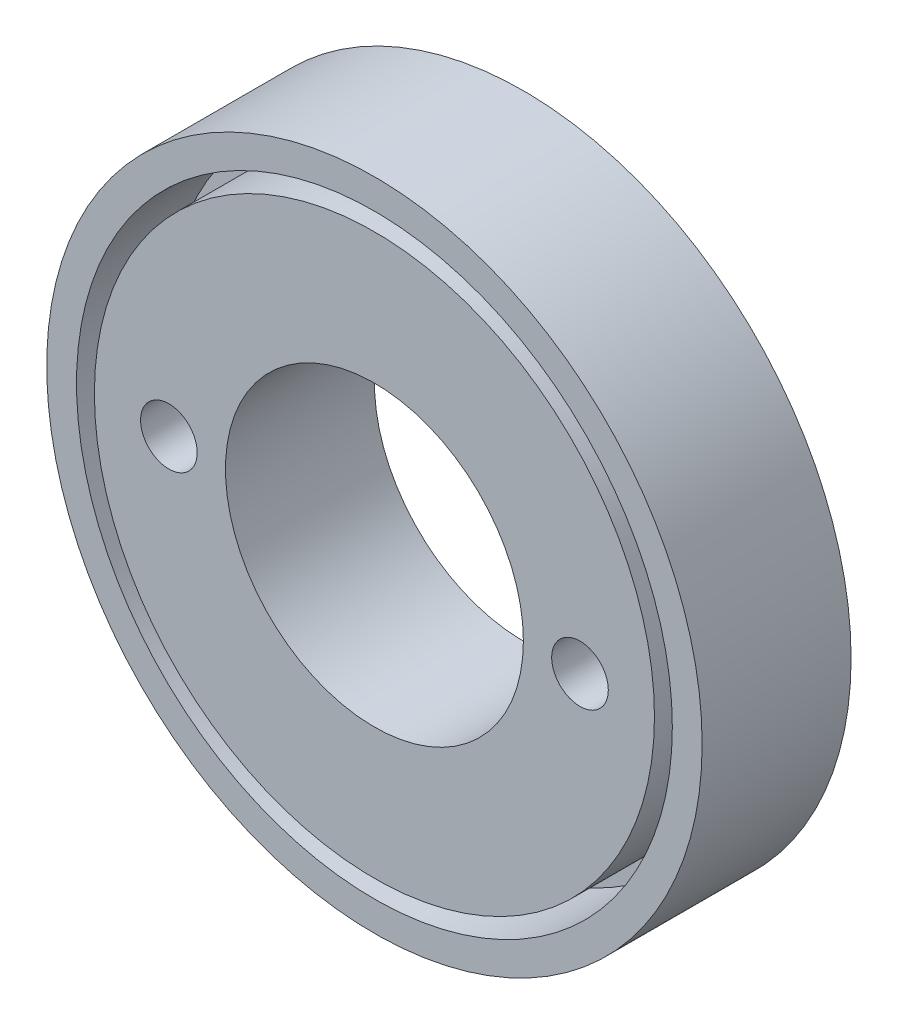
ISO-10303-21;
HEADER;
FILE_DESCRIPTION(('STEP AP214'),'2;1');
FILE_NAME('part.step','',(''),(''),'','','');
FILE_SCHEMA(('AUTOMOTIVE_DESIGN { 1 0 10303 214 1 1 1 1 }'));
ENDSEC;
DATA;
#1=APPLICATION_CONTEXT('core data for automotive mechanical design processes');
#2=APPLICATION_PROTOCOL_DEFINITION('international standard','automotive_design',2000,#1);
#3=PRODUCT_CONTEXT('',#1,'mechanical');
#4=PRODUCT('Part','Part','',(#3));
#5=PRODUCT_RELATED_PRODUCT_CATEGORY('part','',(#4));
#6=PRODUCT_DEFINITION_FORMATION('','',#4);
#7=PRODUCT_DEFINITION_CONTEXT('part definition',#1,'design');
#8=PRODUCT_DEFINITION('design','',#6,#7);
#9=PRODUCT_DEFINITION_SHAPE('','',#8);
#10=(LENGTH_UNIT() NAMED_UNIT(*) SI_UNIT(.MILLI.,.METRE.));
#11=(NAMED_UNIT(*) PLANE_ANGLE_UNIT() SI_UNIT($,.RADIAN.));
#12=(NAMED_UNIT(*) SI_UNIT($,.STERADIAN.) SOLID_ANGLE_UNIT());
#13=UNCERTAINTY_MEASURE_WITH_UNIT(LENGTH_MEASURE(1.E-05),#10,'distance_accuracy_value','');
#14=(GEOMETRIC_REPRESENTATION_CONTEXT(3) GLOBAL_UNCERTAINTY_ASSIGNED_CONTEXT((#13)) GLOBAL_UNIT_ASSIGNED_CONTEXT((#10,
#11,#12)) REPRESENTATION_CONTEXT('',''));
#15=CARTESIAN_POINT('',(0.,0.,0.));
#16=DIRECTION('',(0.,0.,1.));
#17=DIRECTION('',(1.,0.,0.));
#18=AXIS2_PLACEMENT_3D('',#15,#16,#17);
#19=CARTESIAN_POINT('',(0.,0.,10.));
#20=DIRECTION('',(0.,0.,1.));
#21=DIRECTION('',(1.,0.,0.));
#22=AXIS2_PLACEMENT_3D('',#19,#20,#21);
#23=PLANE('',#22);
#24=CARTESIAN_POINT('',(0.,0.,10.));
#25=DIRECTION('',(0.,0.,1.));
#26=DIRECTION('',(1.,0.,0.));
#27=AXIS2_PLACEMENT_3D('',#24,#25,#26);
#28=CIRCLE('',#27,47.);
#29=CARTESIAN_POINT('',(47.,0.,10.));
#30=VERTEX_POINT('',#29);
#31=EDGE_CURVE('E83',#30,#30,#28,.T.);
#32=ORIENTED_EDGE('',*,*,#31,.T.);
#33=EDGE_LOOP('',(#32));
#34=FACE_BOUND('',#33,.T.);
#35=CARTESIAN_POINT('',(34.5,0.,10.));
#36=DIRECTION('',(0.,0.,1.));
#37=DIRECTION('',(1.,0.,0.));
#38=AXIS2_PLACEMENT_3D('',#35,#36,#37);
#39=CIRCLE('',#38,4.75);
#40=CARTESIAN_POINT('',(39.25,0.,10.));
#41=VERTEX_POINT('',#40);
#42=EDGE_CURVE('E67',#41,#41,#39,.F.);
#43=ORIENTED_EDGE('',*,*,#42,.T.);
#44=EDGE_LOOP('',(#43));
#45=FACE_BOUND('',#44,.T.);
#46=CARTESIAN_POINT('',(0.,0.,10.));
#47=DIRECTION('',(0.,0.,1.));
#48=DIRECTION('',(1.,0.,0.));
#49=AXIS2_PLACEMENT_3D('',#46,#47,#48);
#50=CIRCLE('',#49,25.);
#51=CARTESIAN_POINT('',(25.,0.,10.));
#52=VERTEX_POINT('',#51);
#53=EDGE_CURVE('E61',#52,#52,#50,.T.);
#54=ORIENTED_EDGE('',*,*,#53,.F.);
#55=EDGE_LOOP('',(#54));
#56=FACE_BOUND('',#55,.T.);
#57=CARTESIAN_POINT('',(-34.5,0.,10.));
#58=DIRECTION('',(0.,0.,1.));
#59=DIRECTION('',(1.,0.,0.));
#60=AXIS2_PLACEMENT_3D('',#57,#58,#59);
#61=CIRCLE('',#60,4.75);
#62=CARTESIAN_POINT('',(-29.75,0.,10.));
#63=VERTEX_POINT('',#62);
#64=EDGE_CURVE('E73',#63,#63,#61,.T.);
#65=ORIENTED_EDGE('',*,*,#64,.F.);
#66=EDGE_LOOP('',(#65));
#67=FACE_BOUND('',#66,.T.);
#68=ADVANCED_FACE('F46',(#34,#45,#56,#67),#23,.T.);
#69=CARTESIAN_POINT('',(0.,0.,10.));
#70=DIRECTION('',(0.,0.,1.));
#71=DIRECTION('',(1.,0.,0.));
#72=AXIS2_PLACEMENT_3D('',#69,#70,#71);
#73=CIRCLE('',#72,55.);
#74=CARTESIAN_POINT('',(55.,0.,10.));
#75=VERTEX_POINT('',#74);
#76=EDGE_CURVE('E57',#75,#75,#73,.T.);
#77=ORIENTED_EDGE('',*,*,#76,.T.);
#78=EDGE_LOOP('',(#77));
#79=FACE_BOUND('',#78,.T.);
#80=CARTESIAN_POINT('',(0.,0.,10.));
#81=DIRECTION('',(0.,0.,1.));
#82=DIRECTION('',(1.,0.,0.));
#83=AXIS2_PLACEMENT_3D('',#80,#81,#82);
#84=CIRCLE('',#83,50.);
#85=CARTESIAN_POINT('',(50.,0.,10.));
#86=VERTEX_POINT('',#85);
#87=EDGE_CURVE('E79',#86,#86,#84,.T.);
#88=ORIENTED_EDGE('',*,*,#87,.F.);
#89=EDGE_LOOP('',(#88));
#90=FACE_BOUND('',#89,.T.);
#91=ADVANCED_FACE('F107',(#79,#90),#23,.T.);
#92=CARTESIAN_POINT('',(0.,0.,-15.));
#93=DIRECTION('',(0.,0.,1.));
#94=DIRECTION('',(1.,0.,0.));
#95=AXIS2_PLACEMENT_3D('',#92,#93,#94);
#96=CYLINDRICAL_SURFACE('',#95,55.);
#97=CARTESIAN_POINT('',(0.,0.,-15.));
#98=DIRECTION('',(0.,0.,1.));
#99=DIRECTION('',(1.,0.,0.));
#100=AXIS2_PLACEMENT_3D('',#97,#98,#99);
#101=CIRCLE('',#100,55.);
#102=CARTESIAN_POINT('',(55.,0.,-15.));
#103=VERTEX_POINT('',#102);
#104=EDGE_CURVE('E11',#103,#103,#101,.T.);
#105=ORIENTED_EDGE('',*,*,#104,.T.);
#106=EDGE_LOOP('',(#105));
#107=FACE_BOUND('',#106,.T.);
#108=ORIENTED_EDGE('',*,*,#76,.F.);
#109=EDGE_LOOP('',(#108));
#110=FACE_BOUND('',#109,.T.);
#111=ADVANCED_FACE('F48',(#107,#110),#96,.T.);
#112=CARTESIAN_POINT('',(0.,0.,-15.));
#113=DIRECTION('',(0.,0.,1.));
#114=DIRECTION('',(1.,0.,0.));
#115=AXIS2_PLACEMENT_3D('',#112,#113,#114);
#116=PLANE('',#115);
#117=CARTESIAN_POINT('',(0.,0.,-15.));
#118=DIRECTION('',(0.,0.,1.));
#119=DIRECTION('',(1.,0.,0.));
#120=AXIS2_PLACEMENT_3D('',#117,#118,#119);
#121=CIRCLE('',#120,25.);
#122=CARTESIAN_POINT('',(25.,0.,-15.));
#123=VERTEX_POINT('',#122);
#124=EDGE_CURVE('E53',#123,#123,#121,.T.);
#125=ORIENTED_EDGE('',*,*,#124,.T.);
#126=EDGE_LOOP('',(#125));
#127=FACE_BOUND('',#126,.T.);
#128=ORIENTED_EDGE('',*,*,#104,.F.);
#129=EDGE_LOOP('',(#128));
#130=FACE_BOUND('',#129,.T.);
#131=ADVANCED_FACE('F115',(#127,#130),#116,.F.);
#132=CARTESIAN_POINT('',(0.,0.,-15.));
#133=DIRECTION('',(0.,0.,1.));
#134=DIRECTION('',(1.,0.,0.));
#135=AXIS2_PLACEMENT_3D('',#132,#133,#134);
#136=CYLINDRICAL_SURFACE('',#135,25.);
#137=ORIENTED_EDGE('',*,*,#124,.F.);
#138=EDGE_LOOP('',(#137));
#139=FACE_BOUND('',#138,.T.);
#140=ORIENTED_EDGE('',*,*,#53,.T.);
#141=EDGE_LOOP('',(#140));
#142=FACE_BOUND('',#141,.T.);
#143=ADVANCED_FACE('F121',(#139,#142),#136,.F.);
#144=CARTESIAN_POINT('',(34.5,0.,-5.));
#145=DIRECTION('',(0.,0.,1.));
#146=DIRECTION('',(1.,0.,0.));
#147=AXIS2_PLACEMENT_3D('',#144,#145,#146);
#148=CYLINDRICAL_SURFACE('',#147,4.75);
#149=CARTESIAN_POINT('',(34.5,0.,-5.));
#150=DIRECTION('',(0.,0.,1.));
#151=DIRECTION('',(1.,0.,0.));
#152=AXIS2_PLACEMENT_3D('',#149,#150,#151);
#153=CIRCLE('',#152,4.75);
#154=CARTESIAN_POINT('',(39.25,0.,-5.));
#155=VERTEX_POINT('',#154);
#156=EDGE_CURVE('E66',#155,#155,#153,.F.);
#157=ORIENTED_EDGE('',*,*,#156,.T.);
#158=EDGE_LOOP('',(#157));
#159=FACE_BOUND('',#158,.T.);
#160=ORIENTED_EDGE('',*,*,#42,.F.);
#161=EDGE_LOOP('',(#160));
#162=FACE_BOUND('',#161,.T.);
#163=ADVANCED_FACE('F119',(#159,#162),#148,.F.);
#164=CARTESIAN_POINT('',(0.,0.,-5.));
#165=DIRECTION('',(0.,0.,1.));
#166=DIRECTION('',(1.,0.,0.));
#167=AXIS2_PLACEMENT_3D('',#164,#165,#166);
#168=PLANE('',#167);
#169=ORIENTED_EDGE('',*,*,#156,.F.);
#170=EDGE_LOOP('',(#169));
#171=FACE_BOUND('',#170,.T.);
#172=ADVANCED_FACE('F141',(#171),#168,.T.);
#173=CARTESIAN_POINT('',(0.,0.,-5.));
#174=DIRECTION('',(0.,0.,1.));
#175=DIRECTION('',(1.,0.,0.));
#176=AXIS2_PLACEMENT_3D('',#173,#174,#175);
#177=CYLINDRICAL_SURFACE('',#176,47.);
#178=CARTESIAN_POINT('',(0.,0.,-5.));
#179=DIRECTION('',(0.,0.,1.));
#180=DIRECTION('',(1.,0.,0.));
#181=AXIS2_PLACEMENT_3D('',#178,#179,#180);
#182=CIRCLE('',#181,47.);
#183=CARTESIAN_POINT('',(47.,0.,-5.));
#184=VERTEX_POINT('',#183);
#185=EDGE_CURVE('E82',#184,#184,#182,.T.);
#186=ORIENTED_EDGE('',*,*,#185,.T.);
#187=EDGE_LOOP('',(#186));
#188=FACE_BOUND('',#187,.T.);
#189=ORIENTED_EDGE('',*,*,#31,.F.);
#190=EDGE_LOOP('',(#189));
#191=FACE_BOUND('',#190,.T.);
#192=ADVANCED_FACE('F91',(#188,#191),#177,.T.);
#193=CARTESIAN_POINT('',(0.,0.,-5.));
#194=DIRECTION('',(0.,0.,1.));
#195=DIRECTION('',(1.,0.,0.));
#196=AXIS2_PLACEMENT_3D('',#193,#194,#195);
#197=CYLINDRICAL_SURFACE('',#196,50.);
#198=CARTESIAN_POINT('',(0.,0.,-5.));
#199=DIRECTION('',(0.,0.,1.));
#200=DIRECTION('',(1.,0.,0.));
#201=AXIS2_PLACEMENT_3D('',#198,#199,#200);
#202=CIRCLE('',#201,50.);
#203=CARTESIAN_POINT('',(50.,0.,-5.));
#204=VERTEX_POINT('',#203);
#205=EDGE_CURVE('E76',#204,#204,#202,.T.);
#206=ORIENTED_EDGE('',*,*,#205,.F.);
#207=EDGE_LOOP('',(#206));
#208=FACE_BOUND('',#207,.T.);
#209=ORIENTED_EDGE('',*,*,#87,.T.);
#210=EDGE_LOOP('',(#209));
#211=FACE_BOUND('',#210,.T.);
#212=ADVANCED_FACE('F98',(#208,#211),#197,.F.);
#213=CARTESIAN_POINT('',(0.,0.,-5.));
#214=DIRECTION('',(0.,0.,1.));
#215=DIRECTION('',(1.,0.,0.));
#216=AXIS2_PLACEMENT_3D('',#213,#214,#215);
#217=PLANE('',#216);
#218=ORIENTED_EDGE('',*,*,#185,.F.);
#219=EDGE_LOOP('',(#218));
#220=FACE_BOUND('',#219,.T.);
#221=ORIENTED_EDGE('',*,*,#205,.T.);
#222=EDGE_LOOP('',(#221));
#223=FACE_BOUND('',#222,.T.);
#224=ADVANCED_FACE('F94',(#220,#223),#217,.T.);
#225=CARTESIAN_POINT('',(-34.5,0.,-5.));
#226=DIRECTION('',(0.,0.,1.));
#227=DIRECTION('',(1.,0.,0.));
#228=AXIS2_PLACEMENT_3D('',#225,#226,#227);
#229=CYLINDRICAL_SURFACE('',#228,4.75);
#230=CARTESIAN_POINT('',(-34.5,0.,-5.));
#231=DIRECTION('',(0.,0.,1.));
#232=DIRECTION('',(1.,0.,0.));
#233=AXIS2_PLACEMENT_3D('',#230,#231,#232);
#234=CIRCLE('',#233,4.75);
#235=CARTESIAN_POINT('',(-29.75,0.,-5.));
#236=VERTEX_POINT('',#235);
#237=EDGE_CURVE('E70',#236,#236,#234,.T.);
#238=ORIENTED_EDGE('',*,*,#237,.F.);
#239=EDGE_LOOP('',(#238));
#240=FACE_BOUND('',#239,.T.);
#241=ORIENTED_EDGE('',*,*,#64,.T.);
#242=EDGE_LOOP('',(#241));
#243=FACE_BOUND('',#242,.T.);
#244=ADVANCED_FACE('F97',(#240,#243),#229,.F.);
#245=CARTESIAN_POINT('',(0.,0.,-5.));
#246=DIRECTION('',(0.,0.,1.));
#247=DIRECTION('',(1.,0.,0.));
#248=AXIS2_PLACEMENT_3D('',#245,#246,#247);
#249=PLANE('',#248);
#250=ORIENTED_EDGE('',*,*,#237,.T.);
#251=EDGE_LOOP('',(#250));
#252=FACE_BOUND('',#251,.T.);
#253=ADVANCED_FACE('F168',(#252),#249,.T.);
#254=CLOSED_SHELL('',(#68,#91,#111,#131,#143,#163,#172,#192,#212,#224,#244,#253));
#255=MANIFOLD_SOLID_BREP('B2',#254);
#256=ADVANCED_BREP_SHAPE_REPRESENTATION('',(#18,#255),#14);
#257=SHAPE_DEFINITION_REPRESENTATION(#9,#256);
ENDSEC;
END-ISO-10303-21;
